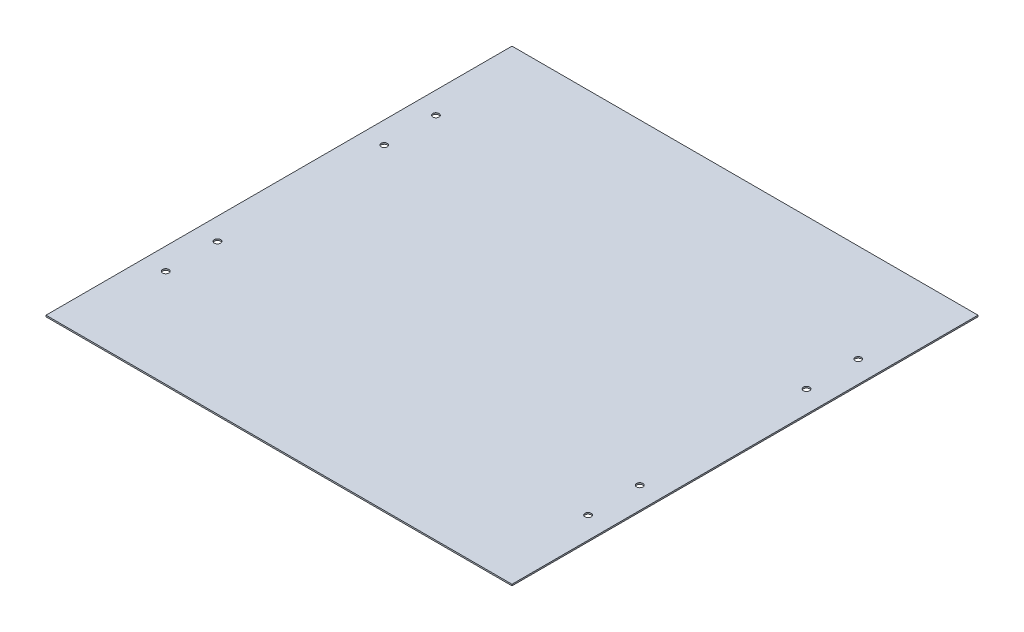
ISO-10303-21;
HEADER;
FILE_DESCRIPTION(('STEP AP214'),'2;1');
FILE_NAME('part.step','',(''),(''),'','','');
FILE_SCHEMA(('AUTOMOTIVE_DESIGN { 1 0 10303 214 1 1 1 1 }'));
ENDSEC;
DATA;
#1=APPLICATION_CONTEXT('core data for automotive mechanical design processes');
#2=APPLICATION_PROTOCOL_DEFINITION('international standard','automotive_design',2000,#1);
#3=PRODUCT_CONTEXT('',#1,'mechanical');
#4=PRODUCT('Part','Part','',(#3));
#5=PRODUCT_RELATED_PRODUCT_CATEGORY('part','',(#4));
#6=PRODUCT_DEFINITION_FORMATION('','',#4);
#7=PRODUCT_DEFINITION_CONTEXT('part definition',#1,'design');
#8=PRODUCT_DEFINITION('design','',#6,#7);
#9=PRODUCT_DEFINITION_SHAPE('','',#8);
#10=(LENGTH_UNIT() NAMED_UNIT(*) SI_UNIT(.MILLI.,.METRE.));
#11=(NAMED_UNIT(*) PLANE_ANGLE_UNIT() SI_UNIT($,.RADIAN.));
#12=(NAMED_UNIT(*) SI_UNIT($,.STERADIAN.) SOLID_ANGLE_UNIT());
#13=UNCERTAINTY_MEASURE_WITH_UNIT(LENGTH_MEASURE(1.E-05),#10,'distance_accuracy_value','');
#14=(GEOMETRIC_REPRESENTATION_CONTEXT(3) GLOBAL_UNCERTAINTY_ASSIGNED_CONTEXT((#13)) GLOBAL_UNIT_ASSIGNED_CONTEXT((#10,
#11,#12)) REPRESENTATION_CONTEXT('',''));
#15=CARTESIAN_POINT('',(0.,0.,0.));
#16=DIRECTION('',(0.,0.,1.));
#17=DIRECTION('',(1.,0.,0.));
#18=AXIS2_PLACEMENT_3D('',#15,#16,#17);
#19=CARTESIAN_POINT('',(0.,1.,0.));
#20=DIRECTION('',(0.,-1.,0.));
#21=DIRECTION('',(0.,0.,-1.));
#22=AXIS2_PLACEMENT_3D('',#19,#20,#21);
#23=PLANE('',#22);
#24=CARTESIAN_POINT('',(-145.,1.,-92.7499999999999));
#25=DIRECTION('',(0.,-1.,0.));
#26=DIRECTION('',(0.,0.,-1.));
#27=AXIS2_PLACEMENT_3D('',#24,#25,#26);
#28=CIRCLE('',#27,2.15000000000001);
#29=CARTESIAN_POINT('',(-145.,1.,-94.8999999999999));
#30=VERTEX_POINT('',#29);
#31=EDGE_CURVE('E127',#30,#30,#28,.T.);
#32=ORIENTED_EDGE('',*,*,#31,.T.);
#33=EDGE_LOOP('',(#32));
#34=FACE_BOUND('',#33,.T.);
#35=CARTESIAN_POINT('',(145.,1.,92.7499999999999));
#36=DIRECTION('',(0.,-1.,0.));
#37=DIRECTION('',(0.,0.,-1.));
#38=AXIS2_PLACEMENT_3D('',#35,#36,#37);
#39=CIRCLE('',#38,2.15000000000001);
#40=CARTESIAN_POINT('',(145.,1.,90.5999999999999));
#41=VERTEX_POINT('',#40);
#42=EDGE_CURVE('E115',#41,#41,#39,.T.);
#43=ORIENTED_EDGE('',*,*,#42,.T.);
#44=EDGE_LOOP('',(#43));
#45=FACE_BOUND('',#44,.T.);
#46=CARTESIAN_POINT('',(145.,1.,57.25));
#47=DIRECTION('',(0.,1.,0.));
#48=DIRECTION('',(0.,0.,1.));
#49=AXIS2_PLACEMENT_3D('',#46,#47,#48);
#50=CIRCLE('',#49,2.15000000000002);
#51=CARTESIAN_POINT('',(145.,1.,59.4));
#52=VERTEX_POINT('',#51);
#53=EDGE_CURVE('E111',#52,#52,#50,.T.);
#54=ORIENTED_EDGE('',*,*,#53,.F.);
#55=EDGE_LOOP('',(#54));
#56=FACE_BOUND('',#55,.T.);
#57=DIRECTION('',(0.,0.,-1.));
#58=VECTOR('',#57,1.);
#59=CARTESIAN_POINT('',(160.,1.,160.));
#60=LINE('',#59,#58);
#61=CARTESIAN_POINT('',(160.,1.,160.));
#62=VERTEX_POINT('',#61);
#63=CARTESIAN_POINT('',(160.,1.,-160.));
#64=VERTEX_POINT('',#63);
#65=EDGE_CURVE('E87',#62,#64,#60,.T.);
#66=ORIENTED_EDGE('',*,*,#65,.T.);
#67=DIRECTION('',(-1.,0.,0.));
#68=VECTOR('',#67,1.);
#69=CARTESIAN_POINT('',(-160.,1.,-160.));
#70=LINE('',#69,#68);
#71=CARTESIAN_POINT('',(-160.,1.,-160.));
#72=VERTEX_POINT('',#71);
#73=EDGE_CURVE('E82',#64,#72,#70,.T.);
#74=ORIENTED_EDGE('',*,*,#73,.T.);
#75=DIRECTION('',(0.,0.,1.));
#76=VECTOR('',#75,1.);
#77=CARTESIAN_POINT('',(-160.,1.,160.));
#78=LINE('',#77,#76);
#79=CARTESIAN_POINT('',(-160.,1.,160.));
#80=VERTEX_POINT('',#79);
#81=EDGE_CURVE('E85',#72,#80,#78,.T.);
#82=ORIENTED_EDGE('',*,*,#81,.T.);
#83=DIRECTION('',(1.,0.,0.));
#84=VECTOR('',#83,1.);
#85=CARTESIAN_POINT('',(-160.,1.,160.));
#86=LINE('',#85,#84);
#87=EDGE_CURVE('E52',#80,#62,#86,.T.);
#88=ORIENTED_EDGE('',*,*,#87,.T.);
#89=EDGE_LOOP('',(#66,#74,#82,#88));
#90=FACE_BOUND('',#89,.T.);
#91=CARTESIAN_POINT('',(145.,1.,-92.75));
#92=DIRECTION('',(0.,1.,0.));
#93=DIRECTION('',(0.,0.,1.));
#94=AXIS2_PLACEMENT_3D('',#91,#92,#93);
#95=CIRCLE('',#94,2.15000000000001);
#96=CARTESIAN_POINT('',(145.,1.,-90.6));
#97=VERTEX_POINT('',#96);
#98=EDGE_CURVE('E119',#97,#97,#95,.T.);
#99=ORIENTED_EDGE('',*,*,#98,.F.);
#100=EDGE_LOOP('',(#99));
#101=FACE_BOUND('',#100,.T.);
#102=CARTESIAN_POINT('',(145.,1.,-57.2500000000001));
#103=DIRECTION('',(0.,-1.,0.));
#104=DIRECTION('',(0.,0.,-1.));
#105=AXIS2_PLACEMENT_3D('',#102,#103,#104);
#106=CIRCLE('',#105,2.15000000000002);
#107=CARTESIAN_POINT('',(145.,1.,-59.4000000000001));
#108=VERTEX_POINT('',#107);
#109=EDGE_CURVE('E123',#108,#108,#106,.T.);
#110=ORIENTED_EDGE('',*,*,#109,.T.);
#111=EDGE_LOOP('',(#110));
#112=FACE_BOUND('',#111,.T.);
#113=CARTESIAN_POINT('',(-145.,1.,-57.2500000000001));
#114=DIRECTION('',(0.,1.,0.));
#115=DIRECTION('',(0.,0.,1.));
#116=AXIS2_PLACEMENT_3D('',#113,#114,#115);
#117=CIRCLE('',#116,2.15000000000002);
#118=CARTESIAN_POINT('',(-145.,1.,-55.1000000000001));
#119=VERTEX_POINT('',#118);
#120=EDGE_CURVE('E130',#119,#119,#117,.T.);
#121=ORIENTED_EDGE('',*,*,#120,.F.);
#122=EDGE_LOOP('',(#121));
#123=FACE_BOUND('',#122,.T.);
#124=CARTESIAN_POINT('',(-145.,1.,92.7499999999998));
#125=DIRECTION('',(0.,1.,0.));
#126=DIRECTION('',(0.,0.,1.));
#127=AXIS2_PLACEMENT_3D('',#124,#125,#126);
#128=CIRCLE('',#127,2.15000000000001);
#129=CARTESIAN_POINT('',(-145.,1.,94.8999999999998));
#130=VERTEX_POINT('',#129);
#131=EDGE_CURVE('E133',#130,#130,#128,.T.);
#132=ORIENTED_EDGE('',*,*,#131,.F.);
#133=EDGE_LOOP('',(#132));
#134=FACE_BOUND('',#133,.T.);
#135=CARTESIAN_POINT('',(-145.,1.,57.25));
#136=DIRECTION('',(0.,-1.,0.));
#137=DIRECTION('',(0.,0.,-1.));
#138=AXIS2_PLACEMENT_3D('',#135,#136,#137);
#139=CIRCLE('',#138,2.15000000000002);
#140=CARTESIAN_POINT('',(-145.,1.,55.1));
#141=VERTEX_POINT('',#140);
#142=EDGE_CURVE('E143',#141,#141,#139,.T.);
#143=ORIENTED_EDGE('',*,*,#142,.T.);
#144=EDGE_LOOP('',(#143));
#145=FACE_BOUND('',#144,.T.);
#146=ADVANCED_FACE('F33',(#34,#45,#56,#90,#101,#112,#123,#134,#145),#23,.F.);
#147=CARTESIAN_POINT('',(0.,0.,0.));
#148=DIRECTION('',(0.,-1.,0.));
#149=DIRECTION('',(0.,0.,-1.));
#150=AXIS2_PLACEMENT_3D('',#147,#148,#149);
#151=PLANE('',#150);
#152=CARTESIAN_POINT('',(-145.,0.,-92.7499999999999));
#153=DIRECTION('',(0.,-1.,0.));
#154=DIRECTION('',(0.,0.,-1.));
#155=AXIS2_PLACEMENT_3D('',#152,#153,#154);
#156=CIRCLE('',#155,2.15000000000001);
#157=CARTESIAN_POINT('',(-145.,0.,-94.8999999999999));
#158=VERTEX_POINT('',#157);
#159=EDGE_CURVE('E124',#158,#158,#156,.F.);
#160=ORIENTED_EDGE('',*,*,#159,.T.);
#161=EDGE_LOOP('',(#160));
#162=FACE_BOUND('',#161,.T.);
#163=CARTESIAN_POINT('',(145.,0.,92.7499999999999));
#164=DIRECTION('',(0.,-1.,0.));
#165=DIRECTION('',(0.,0.,-1.));
#166=AXIS2_PLACEMENT_3D('',#163,#164,#165);
#167=CIRCLE('',#166,2.15000000000001);
#168=CARTESIAN_POINT('',(145.,0.,90.5999999999999));
#169=VERTEX_POINT('',#168);
#170=EDGE_CURVE('E112',#169,#169,#167,.F.);
#171=ORIENTED_EDGE('',*,*,#170,.T.);
#172=EDGE_LOOP('',(#171));
#173=FACE_BOUND('',#172,.T.);
#174=CARTESIAN_POINT('',(145.,0.,57.25));
#175=DIRECTION('',(0.,-1.,0.));
#176=DIRECTION('',(0.,0.,-1.));
#177=AXIS2_PLACEMENT_3D('',#174,#175,#176);
#178=CIRCLE('',#177,2.15000000000002);
#179=CARTESIAN_POINT('',(145.,0.,55.1));
#180=VERTEX_POINT('',#179);
#181=EDGE_CURVE('E103',#180,#180,#178,.T.);
#182=ORIENTED_EDGE('',*,*,#181,.F.);
#183=EDGE_LOOP('',(#182));
#184=FACE_BOUND('',#183,.T.);
#185=DIRECTION('',(0.,0.,-1.));
#186=VECTOR('',#185,1.);
#187=CARTESIAN_POINT('',(160.,0.,160.));
#188=LINE('',#187,#186);
#189=CARTESIAN_POINT('',(160.,0.,160.));
#190=VERTEX_POINT('',#189);
#191=CARTESIAN_POINT('',(160.,0.,-160.));
#192=VERTEX_POINT('',#191);
#193=EDGE_CURVE('E100',#190,#192,#188,.T.);
#194=ORIENTED_EDGE('',*,*,#193,.F.);
#195=DIRECTION('',(1.,0.,0.));
#196=VECTOR('',#195,1.);
#197=CARTESIAN_POINT('',(-160.,0.,160.));
#198=LINE('',#197,#196);
#199=CARTESIAN_POINT('',(-160.,0.,160.));
#200=VERTEX_POINT('',#199);
#201=EDGE_CURVE('E75',#200,#190,#198,.T.);
#202=ORIENTED_EDGE('',*,*,#201,.F.);
#203=DIRECTION('',(0.,0.,1.));
#204=VECTOR('',#203,1.);
#205=CARTESIAN_POINT('',(-160.,0.,160.));
#206=LINE('',#205,#204);
#207=CARTESIAN_POINT('',(-160.,0.,-160.));
#208=VERTEX_POINT('',#207);
#209=EDGE_CURVE('E69',#208,#200,#206,.T.);
#210=ORIENTED_EDGE('',*,*,#209,.F.);
#211=DIRECTION('',(-1.,0.,0.));
#212=VECTOR('',#211,1.);
#213=CARTESIAN_POINT('',(-160.,0.,-160.));
#214=LINE('',#213,#212);
#215=EDGE_CURVE('E91',#192,#208,#214,.T.);
#216=ORIENTED_EDGE('',*,*,#215,.F.);
#217=EDGE_LOOP('',(#194,#202,#210,#216));
#218=FACE_BOUND('',#217,.T.);
#219=CARTESIAN_POINT('',(145.,0.,-92.75));
#220=DIRECTION('',(0.,-1.,0.));
#221=DIRECTION('',(0.,0.,-1.));
#222=AXIS2_PLACEMENT_3D('',#219,#220,#221);
#223=CIRCLE('',#222,2.15000000000001);
#224=CARTESIAN_POINT('',(145.,0.,-94.9));
#225=VERTEX_POINT('',#224);
#226=EDGE_CURVE('E116',#225,#225,#223,.T.);
#227=ORIENTED_EDGE('',*,*,#226,.F.);
#228=EDGE_LOOP('',(#227));
#229=FACE_BOUND('',#228,.T.);
#230=CARTESIAN_POINT('',(145.,0.,-57.2500000000001));
#231=DIRECTION('',(0.,-1.,0.));
#232=DIRECTION('',(0.,0.,-1.));
#233=AXIS2_PLACEMENT_3D('',#230,#231,#232);
#234=CIRCLE('',#233,2.15000000000002);
#235=CARTESIAN_POINT('',(145.,0.,-59.4000000000001));
#236=VERTEX_POINT('',#235);
#237=EDGE_CURVE('E120',#236,#236,#234,.F.);
#238=ORIENTED_EDGE('',*,*,#237,.T.);
#239=EDGE_LOOP('',(#238));
#240=FACE_BOUND('',#239,.T.);
#241=CARTESIAN_POINT('',(-145.,0.,-57.2500000000001));
#242=DIRECTION('',(0.,-1.,0.));
#243=DIRECTION('',(0.,0.,-1.));
#244=AXIS2_PLACEMENT_3D('',#241,#242,#243);
#245=CIRCLE('',#244,2.15000000000002);
#246=CARTESIAN_POINT('',(-145.,0.,-59.4000000000001));
#247=VERTEX_POINT('',#246);
#248=EDGE_CURVE('E128',#247,#247,#245,.T.);
#249=ORIENTED_EDGE('',*,*,#248,.F.);
#250=EDGE_LOOP('',(#249));
#251=FACE_BOUND('',#250,.T.);
#252=CARTESIAN_POINT('',(-145.,0.,92.7499999999998));
#253=DIRECTION('',(0.,-1.,0.));
#254=DIRECTION('',(0.,0.,-1.));
#255=AXIS2_PLACEMENT_3D('',#252,#253,#254);
#256=CIRCLE('',#255,2.15000000000001);
#257=CARTESIAN_POINT('',(-145.,0.,90.5999999999998));
#258=VERTEX_POINT('',#257);
#259=EDGE_CURVE('E131',#258,#258,#256,.T.);
#260=ORIENTED_EDGE('',*,*,#259,.F.);
#261=EDGE_LOOP('',(#260));
#262=FACE_BOUND('',#261,.T.);
#263=CARTESIAN_POINT('',(-145.,0.,57.25));
#264=DIRECTION('',(0.,-1.,0.));
#265=DIRECTION('',(0.,0.,-1.));
#266=AXIS2_PLACEMENT_3D('',#263,#264,#265);
#267=CIRCLE('',#266,2.15000000000002);
#268=CARTESIAN_POINT('',(-145.,0.,55.1));
#269=VERTEX_POINT('',#268);
#270=EDGE_CURVE('E37',#269,#269,#267,.F.);
#271=ORIENTED_EDGE('',*,*,#270,.T.);
#272=EDGE_LOOP('',(#271));
#273=FACE_BOUND('',#272,.T.);
#274=ADVANCED_FACE('F160',(#162,#173,#184,#218,#229,#240,#251,#262,#273),#151,.T.);
#275=CARTESIAN_POINT('',(160.,1.,160.));
#276=DIRECTION('',(-1.,0.,0.));
#277=DIRECTION('',(0.,0.,1.));
#278=AXIS2_PLACEMENT_3D('',#275,#276,#277);
#279=PLANE('',#278);
#280=ORIENTED_EDGE('',*,*,#193,.T.);
#281=DIRECTION('',(0.,-1.,0.));
#282=VECTOR('',#281,1.);
#283=CARTESIAN_POINT('',(160.,1.,-160.));
#284=LINE('',#283,#282);
#285=EDGE_CURVE('E11',#64,#192,#284,.T.);
#286=ORIENTED_EDGE('',*,*,#285,.F.);
#287=ORIENTED_EDGE('',*,*,#65,.F.);
#288=DIRECTION('',(0.,-1.,0.));
#289=VECTOR('',#288,1.);
#290=CARTESIAN_POINT('',(160.,1.,160.));
#291=LINE('',#290,#289);
#292=EDGE_CURVE('E96',#62,#190,#291,.T.);
#293=ORIENTED_EDGE('',*,*,#292,.T.);
#294=EDGE_LOOP('',(#280,#286,#287,#293));
#295=FACE_BOUND('',#294,.T.);
#296=ADVANCED_FACE('F35',(#295),#279,.F.);
#297=CARTESIAN_POINT('',(-160.,1.,-160.));
#298=DIRECTION('',(0.,0.,1.));
#299=DIRECTION('',(1.,0.,0.));
#300=AXIS2_PLACEMENT_3D('',#297,#298,#299);
#301=PLANE('',#300);
#302=ORIENTED_EDGE('',*,*,#215,.T.);
#303=DIRECTION('',(0.,-1.,0.));
#304=VECTOR('',#303,1.);
#305=CARTESIAN_POINT('',(-160.,1.,-160.));
#306=LINE('',#305,#304);
#307=EDGE_CURVE('E43',#72,#208,#306,.T.);
#308=ORIENTED_EDGE('',*,*,#307,.F.);
#309=ORIENTED_EDGE('',*,*,#73,.F.);
#310=ORIENTED_EDGE('',*,*,#285,.T.);
#311=EDGE_LOOP('',(#302,#308,#309,#310));
#312=FACE_BOUND('',#311,.T.);
#313=ADVANCED_FACE('F90',(#312),#301,.F.);
#314=CARTESIAN_POINT('',(-160.,1.,160.));
#315=DIRECTION('',(1.,0.,0.));
#316=DIRECTION('',(0.,0.,-1.));
#317=AXIS2_PLACEMENT_3D('',#314,#315,#316);
#318=PLANE('',#317);
#319=ORIENTED_EDGE('',*,*,#209,.T.);
#320=DIRECTION('',(0.,-1.,0.));
#321=VECTOR('',#320,1.);
#322=CARTESIAN_POINT('',(-160.,1.,160.));
#323=LINE('',#322,#321);
#324=EDGE_CURVE('E92',#80,#200,#323,.T.);
#325=ORIENTED_EDGE('',*,*,#324,.F.);
#326=ORIENTED_EDGE('',*,*,#81,.F.);
#327=ORIENTED_EDGE('',*,*,#307,.T.);
#328=EDGE_LOOP('',(#319,#325,#326,#327));
#329=FACE_BOUND('',#328,.T.);
#330=ADVANCED_FACE('F94',(#329),#318,.F.);
#331=CARTESIAN_POINT('',(-160.,1.,160.));
#332=DIRECTION('',(0.,0.,-1.));
#333=DIRECTION('',(-1.,0.,0.));
#334=AXIS2_PLACEMENT_3D('',#331,#332,#333);
#335=PLANE('',#334);
#336=ORIENTED_EDGE('',*,*,#201,.T.);
#337=ORIENTED_EDGE('',*,*,#292,.F.);
#338=ORIENTED_EDGE('',*,*,#87,.F.);
#339=ORIENTED_EDGE('',*,*,#324,.T.);
#340=EDGE_LOOP('',(#336,#337,#338,#339));
#341=FACE_BOUND('',#340,.T.);
#342=ADVANCED_FACE('F172',(#341),#335,.F.);
#343=CARTESIAN_POINT('',(145.,-1.,57.25));
#344=DIRECTION('',(0.,1.,0.));
#345=DIRECTION('',(0.,0.,1.));
#346=AXIS2_PLACEMENT_3D('',#343,#344,#345);
#347=CYLINDRICAL_SURFACE('',#346,2.15000000000002);
#348=ORIENTED_EDGE('',*,*,#181,.T.);
#349=EDGE_LOOP('',(#348));
#350=FACE_BOUND('',#349,.T.);
#351=ORIENTED_EDGE('',*,*,#53,.T.);
#352=EDGE_LOOP('',(#351));
#353=FACE_BOUND('',#352,.T.);
#354=ADVANCED_FACE('F157',(#350,#353),#347,.F.);
#355=CARTESIAN_POINT('',(145.,-1.,92.7499999999999));
#356=DIRECTION('',(0.,1.,0.));
#357=DIRECTION('',(0.,0.,1.));
#358=AXIS2_PLACEMENT_3D('',#355,#356,#357);
#359=CYLINDRICAL_SURFACE('',#358,2.15000000000001);
#360=ORIENTED_EDGE('',*,*,#170,.F.);
#361=EDGE_LOOP('',(#360));
#362=FACE_BOUND('',#361,.T.);
#363=ORIENTED_EDGE('',*,*,#42,.F.);
#364=EDGE_LOOP('',(#363));
#365=FACE_BOUND('',#364,.T.);
#366=ADVANCED_FACE('F222',(#362,#365),#359,.F.);
#367=CARTESIAN_POINT('',(145.,-1.,-92.75));
#368=DIRECTION('',(0.,1.,0.));
#369=DIRECTION('',(0.,0.,1.));
#370=AXIS2_PLACEMENT_3D('',#367,#368,#369);
#371=CYLINDRICAL_SURFACE('',#370,2.15000000000001);
#372=ORIENTED_EDGE('',*,*,#226,.T.);
#373=EDGE_LOOP('',(#372));
#374=FACE_BOUND('',#373,.T.);
#375=ORIENTED_EDGE('',*,*,#98,.T.);
#376=EDGE_LOOP('',(#375));
#377=FACE_BOUND('',#376,.T.);
#378=ADVANCED_FACE('F219',(#374,#377),#371,.F.);
#379=CARTESIAN_POINT('',(145.,-1.,-57.2500000000001));
#380=DIRECTION('',(0.,1.,0.));
#381=DIRECTION('',(0.,0.,1.));
#382=AXIS2_PLACEMENT_3D('',#379,#380,#381);
#383=CYLINDRICAL_SURFACE('',#382,2.15000000000002);
#384=ORIENTED_EDGE('',*,*,#237,.F.);
#385=EDGE_LOOP('',(#384));
#386=FACE_BOUND('',#385,.T.);
#387=ORIENTED_EDGE('',*,*,#109,.F.);
#388=EDGE_LOOP('',(#387));
#389=FACE_BOUND('',#388,.T.);
#390=ADVANCED_FACE('F215',(#386,#389),#383,.F.);
#391=CARTESIAN_POINT('',(-145.,-1.,-92.7499999999999));
#392=DIRECTION('',(0.,1.,0.));
#393=DIRECTION('',(0.,0.,1.));
#394=AXIS2_PLACEMENT_3D('',#391,#392,#393);
#395=CYLINDRICAL_SURFACE('',#394,2.15000000000001);
#396=ORIENTED_EDGE('',*,*,#159,.F.);
#397=EDGE_LOOP('',(#396));
#398=FACE_BOUND('',#397,.T.);
#399=ORIENTED_EDGE('',*,*,#31,.F.);
#400=EDGE_LOOP('',(#399));
#401=FACE_BOUND('',#400,.T.);
#402=ADVANCED_FACE('F211',(#398,#401),#395,.F.);
#403=CARTESIAN_POINT('',(-145.,-1.,-57.2500000000001));
#404=DIRECTION('',(0.,1.,0.));
#405=DIRECTION('',(0.,0.,1.));
#406=AXIS2_PLACEMENT_3D('',#403,#404,#405);
#407=CYLINDRICAL_SURFACE('',#406,2.15000000000002);
#408=ORIENTED_EDGE('',*,*,#248,.T.);
#409=EDGE_LOOP('',(#408));
#410=FACE_BOUND('',#409,.T.);
#411=ORIENTED_EDGE('',*,*,#120,.T.);
#412=EDGE_LOOP('',(#411));
#413=FACE_BOUND('',#412,.T.);
#414=ADVANCED_FACE('F206',(#410,#413),#407,.F.);
#415=CARTESIAN_POINT('',(-145.,-1.,92.7499999999998));
#416=DIRECTION('',(0.,1.,0.));
#417=DIRECTION('',(0.,0.,1.));
#418=AXIS2_PLACEMENT_3D('',#415,#416,#417);
#419=CYLINDRICAL_SURFACE('',#418,2.15000000000001);
#420=ORIENTED_EDGE('',*,*,#259,.T.);
#421=EDGE_LOOP('',(#420));
#422=FACE_BOUND('',#421,.T.);
#423=ORIENTED_EDGE('',*,*,#131,.T.);
#424=EDGE_LOOP('',(#423));
#425=FACE_BOUND('',#424,.T.);
#426=ADVANCED_FACE('F198',(#422,#425),#419,.F.);
#427=CARTESIAN_POINT('',(-145.,-1.,57.25));
#428=DIRECTION('',(0.,1.,0.));
#429=DIRECTION('',(0.,0.,1.));
#430=AXIS2_PLACEMENT_3D('',#427,#428,#429);
#431=CYLINDRICAL_SURFACE('',#430,2.15000000000002);
#432=ORIENTED_EDGE('',*,*,#270,.F.);
#433=EDGE_LOOP('',(#432));
#434=FACE_BOUND('',#433,.T.);
#435=ORIENTED_EDGE('',*,*,#142,.F.);
#436=EDGE_LOOP('',(#435));
#437=FACE_BOUND('',#436,.T.);
#438=ADVANCED_FACE('F195',(#434,#437),#431,.F.);
#439=CLOSED_SHELL('',(#146,#274,#296,#313,#330,#342,#354,#366,#378,#390,#402,#414,#426,#438));
#440=MANIFOLD_SOLID_BREP('B2',#439);
#441=ADVANCED_BREP_SHAPE_REPRESENTATION('',(#18,#440),#14);
#442=SHAPE_DEFINITION_REPRESENTATION(#9,#441);
ENDSEC;
END-ISO-10303-21;
